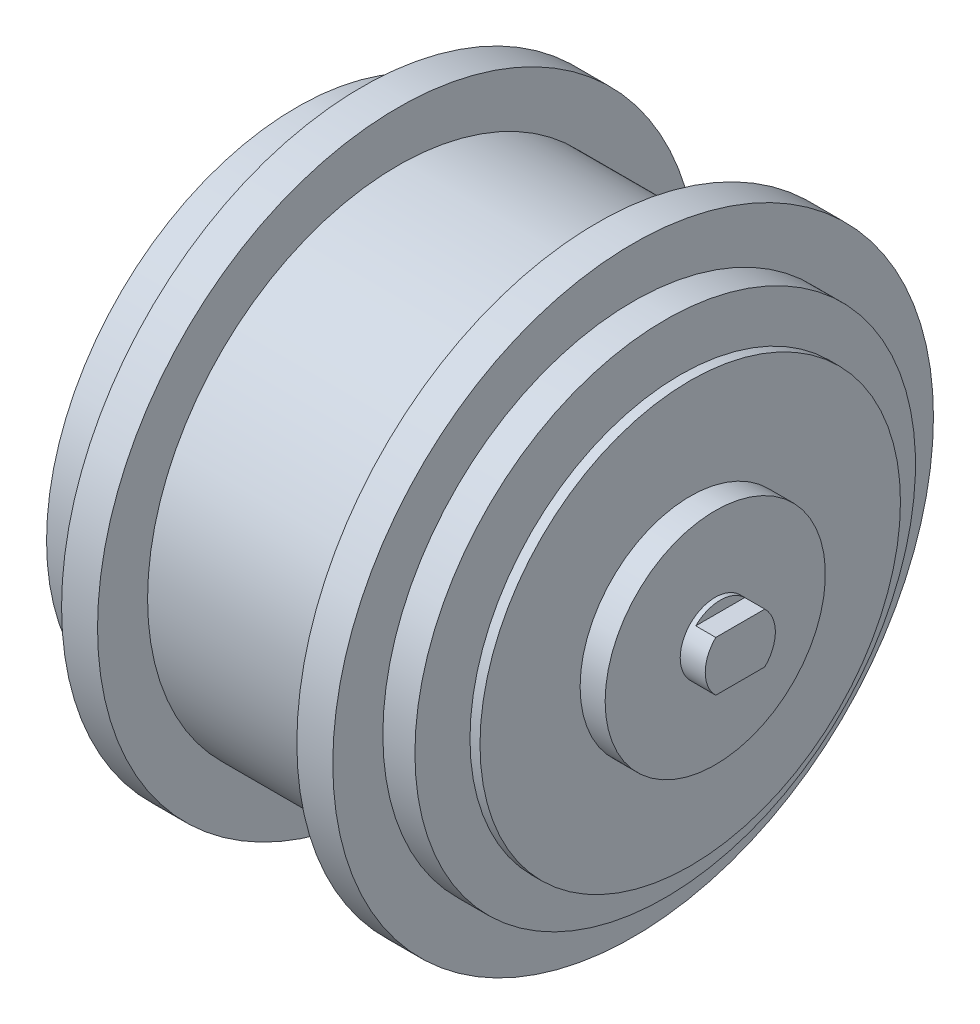
ISO-10303-21;
HEADER;
FILE_DESCRIPTION(('STEP AP214'),'2;1');
FILE_NAME('part.step','',(''),(''),'','','');
FILE_SCHEMA(('AUTOMOTIVE_DESIGN { 1 0 10303 214 1 1 1 1 }'));
ENDSEC;
DATA;
#1=APPLICATION_CONTEXT('core data for automotive mechanical design processes');
#2=APPLICATION_PROTOCOL_DEFINITION('international standard','automotive_design',2000,#1);
#3=PRODUCT_CONTEXT('',#1,'mechanical');
#4=PRODUCT('Part','Part','',(#3));
#5=PRODUCT_RELATED_PRODUCT_CATEGORY('part','',(#4));
#6=PRODUCT_DEFINITION_FORMATION('','',#4);
#7=PRODUCT_DEFINITION_CONTEXT('part definition',#1,'design');
#8=PRODUCT_DEFINITION('design','',#6,#7);
#9=PRODUCT_DEFINITION_SHAPE('','',#8);
#10=(LENGTH_UNIT() NAMED_UNIT(*) SI_UNIT(.MILLI.,.METRE.));
#11=(NAMED_UNIT(*) PLANE_ANGLE_UNIT() SI_UNIT($,.RADIAN.));
#12=(NAMED_UNIT(*) SI_UNIT($,.STERADIAN.) SOLID_ANGLE_UNIT());
#13=UNCERTAINTY_MEASURE_WITH_UNIT(LENGTH_MEASURE(1.E-05),#10,'distance_accuracy_value','');
#14=(GEOMETRIC_REPRESENTATION_CONTEXT(3) GLOBAL_UNCERTAINTY_ASSIGNED_CONTEXT((#13)) GLOBAL_UNIT_ASSIGNED_CONTEXT((#10,
#11,#12)) REPRESENTATION_CONTEXT('',''));
#15=CARTESIAN_POINT('',(0.,0.,0.));
#16=DIRECTION('',(0.,0.,1.));
#17=DIRECTION('',(1.,0.,0.));
#18=AXIS2_PLACEMENT_3D('',#15,#16,#17);
#19=CARTESIAN_POINT('',(0.,0.,0.));
#20=DIRECTION('',(-1.,0.,0.));
#21=DIRECTION('',(0.,0.,1.));
#22=AXIS2_PLACEMENT_3D('',#19,#20,#21);
#23=CYLINDRICAL_SURFACE('',#22,8.5);
#24=CARTESIAN_POINT('',(43.5,0.,0.));
#25=DIRECTION('',(-1.,0.,0.));
#26=DIRECTION('',(0.,0.,1.));
#27=AXIS2_PLACEMENT_3D('',#24,#25,#26);
#28=CIRCLE('',#27,8.5);
#29=CARTESIAN_POINT('',(43.5,0.,8.5));
#30=VERTEX_POINT('',#29);
#31=EDGE_CURVE('E11',#30,#30,#28,.T.);
#32=ORIENTED_EDGE('',*,*,#31,.T.);
#33=EDGE_LOOP('',(#32));
#34=FACE_BOUND('',#33,.T.);
#35=CARTESIAN_POINT('',(36.,0.,0.));
#36=DIRECTION('',(-1.,0.,0.));
#37=DIRECTION('',(0.,0.,1.));
#38=AXIS2_PLACEMENT_3D('',#35,#36,#37);
#39=CIRCLE('',#38,8.5);
#40=CARTESIAN_POINT('',(36.,0.,8.5));
#41=VERTEX_POINT('',#40);
#42=EDGE_CURVE('E299',#41,#41,#39,.T.);
#43=ORIENTED_EDGE('',*,*,#42,.F.);
#44=EDGE_LOOP('',(#43));
#45=FACE_BOUND('',#44,.T.);
#46=ADVANCED_FACE('F33',(#34,#45),#23,.T.);
#47=CARTESIAN_POINT('',(43.5,8.5,0.));
#48=DIRECTION('',(1.,0.,0.));
#49=DIRECTION('',(0.,0.,-1.));
#50=AXIS2_PLACEMENT_3D('',#47,#48,#49);
#51=PLANE('',#50);
#52=ORIENTED_EDGE('',*,*,#31,.F.);
#53=EDGE_LOOP('',(#52));
#54=FACE_BOUND('',#53,.T.);
#55=CARTESIAN_POINT('',(43.5,0.,0.));
#56=DIRECTION('',(-1.,0.,0.));
#57=DIRECTION('',(0.,0.,1.));
#58=AXIS2_PLACEMENT_3D('',#55,#56,#57);
#59=CIRCLE('',#58,17.);
#60=CARTESIAN_POINT('',(43.5,0.,17.));
#61=VERTEX_POINT('',#60);
#62=EDGE_CURVE('E40',#61,#61,#59,.T.);
#63=ORIENTED_EDGE('',*,*,#62,.T.);
#64=EDGE_LOOP('',(#63));
#65=FACE_BOUND('',#64,.T.);
#66=ADVANCED_FACE('F165',(#54,#65),#51,.F.);
#67=CARTESIAN_POINT('',(0.,0.,0.));
#68=DIRECTION('',(-1.,0.,0.));
#69=DIRECTION('',(0.,0.,1.));
#70=AXIS2_PLACEMENT_3D('',#67,#68,#69);
#71=CYLINDRICAL_SURFACE('',#70,17.);
#72=ORIENTED_EDGE('',*,*,#62,.F.);
#73=EDGE_LOOP('',(#72));
#74=FACE_BOUND('',#73,.T.);
#75=CARTESIAN_POINT('',(46.5,0.,0.));
#76=DIRECTION('',(-1.,0.,0.));
#77=DIRECTION('',(0.,0.,1.));
#78=AXIS2_PLACEMENT_3D('',#75,#76,#77);
#79=CIRCLE('',#78,17.);
#80=CARTESIAN_POINT('',(46.5,0.,17.));
#81=VERTEX_POINT('',#80);
#82=EDGE_CURVE('E160',#81,#81,#79,.T.);
#83=ORIENTED_EDGE('',*,*,#82,.T.);
#84=EDGE_LOOP('',(#83));
#85=FACE_BOUND('',#84,.T.);
#86=ADVANCED_FACE('F167',(#74,#85),#71,.T.);
#87=CARTESIAN_POINT('',(46.5,17.,0.));
#88=DIRECTION('',(1.,0.,0.));
#89=DIRECTION('',(0.,0.,-1.));
#90=AXIS2_PLACEMENT_3D('',#87,#88,#89);
#91=PLANE('',#90);
#92=ORIENTED_EDGE('',*,*,#82,.F.);
#93=EDGE_LOOP('',(#92));
#94=FACE_BOUND('',#93,.T.);
#95=CARTESIAN_POINT('',(46.5,0.,0.));
#96=DIRECTION('',(-1.,0.,0.));
#97=DIRECTION('',(0.,0.,1.));
#98=AXIS2_PLACEMENT_3D('',#95,#96,#97);
#99=CIRCLE('',#98,36.3185583303819);
#100=CARTESIAN_POINT('',(46.5,0.,36.3185583303819));
#101=VERTEX_POINT('',#100);
#102=EDGE_CURVE('E157',#101,#101,#99,.T.);
#103=ORIENTED_EDGE('',*,*,#102,.T.);
#104=EDGE_LOOP('',(#103));
#105=FACE_BOUND('',#104,.T.);
#106=ADVANCED_FACE('F170',(#94,#105),#91,.F.);
#107=CARTESIAN_POINT('',(53.5689655172414,0.,0.));
#108=DIRECTION('',(1.,0.,0.));
#109=DIRECTION('',(0.,0.,-1.));
#110=AXIS2_PLACEMENT_3D('',#107,#108,#109);
#111=CONICAL_SURFACE('',#110,50.,1.09389172935502);
#112=ORIENTED_EDGE('',*,*,#102,.F.);
#113=EDGE_LOOP('',(#112));
#114=FACE_BOUND('',#113,.T.);
#115=CARTESIAN_POINT('',(53.5689655172414,0.,0.));
#116=DIRECTION('',(-1.,0.,0.));
#117=DIRECTION('',(0.,0.,1.));
#118=AXIS2_PLACEMENT_3D('',#115,#116,#117);
#119=CIRCLE('',#118,50.);
#120=CARTESIAN_POINT('',(53.5689655172414,0.,50.));
#121=VERTEX_POINT('',#120);
#122=EDGE_CURVE('E154',#121,#121,#119,.T.);
#123=ORIENTED_EDGE('',*,*,#122,.T.);
#124=EDGE_LOOP('',(#123));
#125=FACE_BOUND('',#124,.T.);
#126=ADVANCED_FACE('F176',(#114,#125),#111,.T.);
#127=CARTESIAN_POINT('',(0.,0.,0.));
#128=DIRECTION('',(-1.,0.,0.));
#129=DIRECTION('',(0.,0.,1.));
#130=AXIS2_PLACEMENT_3D('',#127,#128,#129);
#131=CYLINDRICAL_SURFACE('',#130,50.);
#132=ORIENTED_EDGE('',*,*,#122,.F.);
#133=EDGE_LOOP('',(#132));
#134=FACE_BOUND('',#133,.T.);
#135=CARTESIAN_POINT('',(66.5689655172414,0.,0.));
#136=DIRECTION('',(-1.,0.,0.));
#137=DIRECTION('',(0.,0.,1.));
#138=AXIS2_PLACEMENT_3D('',#135,#136,#137);
#139=CIRCLE('',#138,50.);
#140=CARTESIAN_POINT('',(66.5689655172414,0.,50.));
#141=VERTEX_POINT('',#140);
#142=EDGE_CURVE('E151',#141,#141,#139,.T.);
#143=ORIENTED_EDGE('',*,*,#142,.T.);
#144=EDGE_LOOP('',(#143));
#145=FACE_BOUND('',#144,.T.);
#146=ADVANCED_FACE('F182',(#134,#145),#131,.T.);
#147=CARTESIAN_POINT('',(66.5689655172414,50.,0.));
#148=DIRECTION('',(1.,0.,0.));
#149=DIRECTION('',(0.,0.,-1.));
#150=AXIS2_PLACEMENT_3D('',#147,#148,#149);
#151=PLANE('',#150);
#152=ORIENTED_EDGE('',*,*,#142,.F.);
#153=EDGE_LOOP('',(#152));
#154=FACE_BOUND('',#153,.T.);
#155=CARTESIAN_POINT('',(66.5689655172414,0.,0.));
#156=DIRECTION('',(-1.,0.,0.));
#157=DIRECTION('',(0.,0.,1.));
#158=AXIS2_PLACEMENT_3D('',#155,#156,#157);
#159=CIRCLE('',#158,60.);
#160=CARTESIAN_POINT('',(66.5689655172414,0.,60.));
#161=VERTEX_POINT('',#160);
#162=EDGE_CURVE('E148',#161,#161,#159,.T.);
#163=ORIENTED_EDGE('',*,*,#162,.T.);
#164=EDGE_LOOP('',(#163));
#165=FACE_BOUND('',#164,.T.);
#166=ADVANCED_FACE('F188',(#154,#165),#151,.F.);
#167=CARTESIAN_POINT('',(0.,0.,0.));
#168=DIRECTION('',(-1.,0.,0.));
#169=DIRECTION('',(0.,0.,1.));
#170=AXIS2_PLACEMENT_3D('',#167,#168,#169);
#171=CYLINDRICAL_SURFACE('',#170,60.);
#172=ORIENTED_EDGE('',*,*,#162,.F.);
#173=EDGE_LOOP('',(#172));
#174=FACE_BOUND('',#173,.T.);
#175=CARTESIAN_POINT('',(73.7510344827586,0.,0.));
#176=DIRECTION('',(-1.,0.,0.));
#177=DIRECTION('',(0.,0.,1.));
#178=AXIS2_PLACEMENT_3D('',#175,#176,#177);
#179=CIRCLE('',#178,60.);
#180=CARTESIAN_POINT('',(73.7510344827586,0.,60.));
#181=VERTEX_POINT('',#180);
#182=EDGE_CURVE('E145',#181,#181,#179,.T.);
#183=ORIENTED_EDGE('',*,*,#182,.T.);
#184=EDGE_LOOP('',(#183));
#185=FACE_BOUND('',#184,.T.);
#186=ADVANCED_FACE('F194',(#174,#185),#171,.T.);
#187=CARTESIAN_POINT('',(73.7510344827586,60.,0.));
#188=DIRECTION('',(-1.,0.,0.));
#189=DIRECTION('',(0.,0.,1.));
#190=AXIS2_PLACEMENT_3D('',#187,#188,#189);
#191=PLANE('',#190);
#192=ORIENTED_EDGE('',*,*,#182,.F.);
#193=EDGE_LOOP('',(#192));
#194=FACE_BOUND('',#193,.T.);
#195=CARTESIAN_POINT('',(73.7510344827586,0.,0.));
#196=DIRECTION('',(-1.,0.,0.));
#197=DIRECTION('',(0.,0.,1.));
#198=AXIS2_PLACEMENT_3D('',#195,#196,#197);
#199=CIRCLE('',#198,50.);
#200=CARTESIAN_POINT('',(73.7510344827586,0.,50.));
#201=VERTEX_POINT('',#200);
#202=EDGE_CURVE('E142',#201,#201,#199,.T.);
#203=ORIENTED_EDGE('',*,*,#202,.T.);
#204=EDGE_LOOP('',(#203));
#205=FACE_BOUND('',#204,.T.);
#206=ADVANCED_FACE('F200',(#194,#205),#191,.F.);
#207=CARTESIAN_POINT('',(0.,0.,0.));
#208=DIRECTION('',(-1.,0.,0.));
#209=DIRECTION('',(0.,0.,1.));
#210=AXIS2_PLACEMENT_3D('',#207,#208,#209);
#211=CYLINDRICAL_SURFACE('',#210,50.);
#212=ORIENTED_EDGE('',*,*,#202,.F.);
#213=EDGE_LOOP('',(#212));
#214=FACE_BOUND('',#213,.T.);
#215=CARTESIAN_POINT('',(113.568965517241,0.,0.));
#216=DIRECTION('',(-1.,0.,0.));
#217=DIRECTION('',(0.,0.,1.));
#218=AXIS2_PLACEMENT_3D('',#215,#216,#217);
#219=CIRCLE('',#218,50.);
#220=CARTESIAN_POINT('',(113.568965517241,0.,50.));
#221=VERTEX_POINT('',#220);
#222=EDGE_CURVE('E139',#221,#221,#219,.T.);
#223=ORIENTED_EDGE('',*,*,#222,.T.);
#224=EDGE_LOOP('',(#223));
#225=FACE_BOUND('',#224,.T.);
#226=ADVANCED_FACE('F206',(#214,#225),#211,.T.);
#227=CARTESIAN_POINT('',(113.568965517241,50.,0.));
#228=DIRECTION('',(1.,0.,0.));
#229=DIRECTION('',(0.,0.,-1.));
#230=AXIS2_PLACEMENT_3D('',#227,#228,#229);
#231=PLANE('',#230);
#232=ORIENTED_EDGE('',*,*,#222,.F.);
#233=EDGE_LOOP('',(#232));
#234=FACE_BOUND('',#233,.T.);
#235=CARTESIAN_POINT('',(113.568965517241,0.,0.));
#236=DIRECTION('',(-1.,0.,0.));
#237=DIRECTION('',(0.,0.,1.));
#238=AXIS2_PLACEMENT_3D('',#235,#236,#237);
#239=CIRCLE('',#238,60.);
#240=CARTESIAN_POINT('',(113.568965517241,0.,60.));
#241=VERTEX_POINT('',#240);
#242=EDGE_CURVE('E136',#241,#241,#239,.T.);
#243=ORIENTED_EDGE('',*,*,#242,.T.);
#244=EDGE_LOOP('',(#243));
#245=FACE_BOUND('',#244,.T.);
#246=ADVANCED_FACE('F212',(#234,#245),#231,.F.);
#247=CARTESIAN_POINT('',(0.,0.,0.));
#248=DIRECTION('',(-1.,0.,0.));
#249=DIRECTION('',(0.,0.,1.));
#250=AXIS2_PLACEMENT_3D('',#247,#248,#249);
#251=CYLINDRICAL_SURFACE('',#250,60.);
#252=ORIENTED_EDGE('',*,*,#242,.F.);
#253=EDGE_LOOP('',(#252));
#254=FACE_BOUND('',#253,.T.);
#255=CARTESIAN_POINT('',(120.751034482759,0.,0.));
#256=DIRECTION('',(-1.,0.,0.));
#257=DIRECTION('',(0.,0.,1.));
#258=AXIS2_PLACEMENT_3D('',#255,#256,#257);
#259=CIRCLE('',#258,60.);
#260=CARTESIAN_POINT('',(120.751034482759,0.,60.));
#261=VERTEX_POINT('',#260);
#262=EDGE_CURVE('E133',#261,#261,#259,.T.);
#263=ORIENTED_EDGE('',*,*,#262,.T.);
#264=EDGE_LOOP('',(#263));
#265=FACE_BOUND('',#264,.T.);
#266=ADVANCED_FACE('F218',(#254,#265),#251,.T.);
#267=CARTESIAN_POINT('',(120.751034482759,60.,0.));
#268=DIRECTION('',(-1.,0.,0.));
#269=DIRECTION('',(0.,0.,1.));
#270=AXIS2_PLACEMENT_3D('',#267,#268,#269);
#271=PLANE('',#270);
#272=ORIENTED_EDGE('',*,*,#262,.F.);
#273=EDGE_LOOP('',(#272));
#274=FACE_BOUND('',#273,.T.);
#275=CARTESIAN_POINT('',(120.751034482759,0.,0.));
#276=DIRECTION('',(-1.,0.,0.));
#277=DIRECTION('',(0.,0.,1.));
#278=AXIS2_PLACEMENT_3D('',#275,#276,#277);
#279=CIRCLE('',#278,50.);
#280=CARTESIAN_POINT('',(120.751034482759,0.,50.));
#281=VERTEX_POINT('',#280);
#282=EDGE_CURVE('E130',#281,#281,#279,.T.);
#283=ORIENTED_EDGE('',*,*,#282,.T.);
#284=EDGE_LOOP('',(#283));
#285=FACE_BOUND('',#284,.T.);
#286=ADVANCED_FACE('F224',(#274,#285),#271,.F.);
#287=CARTESIAN_POINT('',(0.,0.,0.));
#288=DIRECTION('',(-1.,0.,0.));
#289=DIRECTION('',(0.,0.,1.));
#290=AXIS2_PLACEMENT_3D('',#287,#288,#289);
#291=CYLINDRICAL_SURFACE('',#290,50.);
#292=ORIENTED_EDGE('',*,*,#282,.F.);
#293=EDGE_LOOP('',(#292));
#294=FACE_BOUND('',#293,.T.);
#295=CARTESIAN_POINT('',(127.16,0.,0.));
#296=DIRECTION('',(-1.,0.,0.));
#297=DIRECTION('',(0.,0.,1.));
#298=AXIS2_PLACEMENT_3D('',#295,#296,#297);
#299=CIRCLE('',#298,50.);
#300=CARTESIAN_POINT('',(127.16,0.,50.));
#301=VERTEX_POINT('',#300);
#302=EDGE_CURVE('E127',#301,#301,#299,.T.);
#303=ORIENTED_EDGE('',*,*,#302,.T.);
#304=EDGE_LOOP('',(#303));
#305=FACE_BOUND('',#304,.T.);
#306=ADVANCED_FACE('F230',(#294,#305),#291,.T.);
#307=CARTESIAN_POINT('',(127.16,50.,0.));
#308=DIRECTION('',(-1.,0.,0.));
#309=DIRECTION('',(0.,0.,1.));
#310=AXIS2_PLACEMENT_3D('',#307,#308,#309);
#311=PLANE('',#310);
#312=ORIENTED_EDGE('',*,*,#302,.F.);
#313=EDGE_LOOP('',(#312));
#314=FACE_BOUND('',#313,.T.);
#315=CARTESIAN_POINT('',(127.16,0.,0.));
#316=DIRECTION('',(-1.,0.,0.));
#317=DIRECTION('',(0.,0.,1.));
#318=AXIS2_PLACEMENT_3D('',#315,#316,#317);
#319=CIRCLE('',#318,22.);
#320=CARTESIAN_POINT('',(127.16,0.,22.));
#321=VERTEX_POINT('',#320);
#322=EDGE_CURVE('E124',#321,#321,#319,.T.);
#323=ORIENTED_EDGE('',*,*,#322,.T.);
#324=EDGE_LOOP('',(#323));
#325=FACE_BOUND('',#324,.T.);
#326=ADVANCED_FACE('F236',(#314,#325),#311,.F.);
#327=CARTESIAN_POINT('',(0.,0.,0.));
#328=DIRECTION('',(-1.,0.,0.));
#329=DIRECTION('',(0.,0.,1.));
#330=AXIS2_PLACEMENT_3D('',#327,#328,#329);
#331=CYLINDRICAL_SURFACE('',#330,22.);
#332=ORIENTED_EDGE('',*,*,#322,.F.);
#333=EDGE_LOOP('',(#332));
#334=FACE_BOUND('',#333,.T.);
#335=CARTESIAN_POINT('',(130.16,0.,0.));
#336=DIRECTION('',(-1.,0.,0.));
#337=DIRECTION('',(0.,0.,1.));
#338=AXIS2_PLACEMENT_3D('',#335,#336,#337);
#339=CIRCLE('',#338,22.);
#340=CARTESIAN_POINT('',(130.16,0.,22.));
#341=VERTEX_POINT('',#340);
#342=EDGE_CURVE('E121',#341,#341,#339,.T.);
#343=ORIENTED_EDGE('',*,*,#342,.T.);
#344=EDGE_LOOP('',(#343));
#345=FACE_BOUND('',#344,.T.);
#346=ADVANCED_FACE('F242',(#334,#345),#331,.T.);
#347=CARTESIAN_POINT('',(130.16,22.,0.));
#348=DIRECTION('',(1.,0.,0.));
#349=DIRECTION('',(0.,0.,-1.));
#350=AXIS2_PLACEMENT_3D('',#347,#348,#349);
#351=PLANE('',#350);
#352=ORIENTED_EDGE('',*,*,#342,.F.);
#353=EDGE_LOOP('',(#352));
#354=FACE_BOUND('',#353,.T.);
#355=CARTESIAN_POINT('',(130.16,0.,0.));
#356=DIRECTION('',(-1.,0.,0.));
#357=DIRECTION('',(0.,0.,1.));
#358=AXIS2_PLACEMENT_3D('',#355,#356,#357);
#359=CIRCLE('',#358,42.);
#360=CARTESIAN_POINT('',(130.16,0.,42.));
#361=VERTEX_POINT('',#360);
#362=EDGE_CURVE('E118',#361,#361,#359,.T.);
#363=ORIENTED_EDGE('',*,*,#362,.T.);
#364=EDGE_LOOP('',(#363));
#365=FACE_BOUND('',#364,.T.);
#366=ADVANCED_FACE('F248',(#354,#365),#351,.F.);
#367=CARTESIAN_POINT('',(0.,0.,0.));
#368=DIRECTION('',(-1.,0.,0.));
#369=DIRECTION('',(0.,0.,1.));
#370=AXIS2_PLACEMENT_3D('',#367,#368,#369);
#371=CYLINDRICAL_SURFACE('',#370,42.);
#372=ORIENTED_EDGE('',*,*,#362,.F.);
#373=EDGE_LOOP('',(#372));
#374=FACE_BOUND('',#373,.T.);
#375=CARTESIAN_POINT('',(132.16,0.,0.));
#376=DIRECTION('',(-1.,0.,0.));
#377=DIRECTION('',(0.,0.,1.));
#378=AXIS2_PLACEMENT_3D('',#375,#376,#377);
#379=CIRCLE('',#378,42.);
#380=CARTESIAN_POINT('',(132.16,0.,42.));
#381=VERTEX_POINT('',#380);
#382=EDGE_CURVE('E115',#381,#381,#379,.T.);
#383=ORIENTED_EDGE('',*,*,#382,.T.);
#384=EDGE_LOOP('',(#383));
#385=FACE_BOUND('',#384,.T.);
#386=ADVANCED_FACE('F254',(#374,#385),#371,.T.);
#387=CARTESIAN_POINT('',(132.16,42.,0.));
#388=DIRECTION('',(-1.,0.,0.));
#389=DIRECTION('',(0.,0.,1.));
#390=AXIS2_PLACEMENT_3D('',#387,#388,#389);
#391=PLANE('',#390);
#392=ORIENTED_EDGE('',*,*,#382,.F.);
#393=EDGE_LOOP('',(#392));
#394=FACE_BOUND('',#393,.T.);
#395=CARTESIAN_POINT('',(132.16,0.,0.));
#396=DIRECTION('',(-1.,0.,0.));
#397=DIRECTION('',(0.,0.,1.));
#398=AXIS2_PLACEMENT_3D('',#395,#396,#397);
#399=CIRCLE('',#398,22.);
#400=CARTESIAN_POINT('',(132.16,0.,22.));
#401=VERTEX_POINT('',#400);
#402=EDGE_CURVE('E112',#401,#401,#399,.T.);
#403=ORIENTED_EDGE('',*,*,#402,.T.);
#404=EDGE_LOOP('',(#403));
#405=FACE_BOUND('',#404,.T.);
#406=ADVANCED_FACE('F260',(#394,#405),#391,.F.);
#407=CARTESIAN_POINT('',(0.,0.,0.));
#408=DIRECTION('',(-1.,0.,0.));
#409=DIRECTION('',(0.,0.,1.));
#410=AXIS2_PLACEMENT_3D('',#407,#408,#409);
#411=CYLINDRICAL_SURFACE('',#410,22.);
#412=ORIENTED_EDGE('',*,*,#402,.F.);
#413=EDGE_LOOP('',(#412));
#414=FACE_BOUND('',#413,.T.);
#415=CARTESIAN_POINT('',(137.16,0.,0.));
#416=DIRECTION('',(-1.,0.,0.));
#417=DIRECTION('',(0.,0.,1.));
#418=AXIS2_PLACEMENT_3D('',#415,#416,#417);
#419=CIRCLE('',#418,22.);
#420=CARTESIAN_POINT('',(137.16,0.,22.));
#421=VERTEX_POINT('',#420);
#422=EDGE_CURVE('E109',#421,#421,#419,.T.);
#423=ORIENTED_EDGE('',*,*,#422,.T.);
#424=EDGE_LOOP('',(#423));
#425=FACE_BOUND('',#424,.T.);
#426=ADVANCED_FACE('F266',(#414,#425),#411,.T.);
#427=CARTESIAN_POINT('',(137.16,22.,0.));
#428=DIRECTION('',(-1.,0.,0.));
#429=DIRECTION('',(0.,0.,1.));
#430=AXIS2_PLACEMENT_3D('',#427,#428,#429);
#431=PLANE('',#430);
#432=ORIENTED_EDGE('',*,*,#422,.F.);
#433=EDGE_LOOP('',(#432));
#434=FACE_BOUND('',#433,.T.);
#435=CARTESIAN_POINT('',(137.16,0.,0.));
#436=DIRECTION('',(-1.,0.,0.));
#437=DIRECTION('',(0.,0.,1.));
#438=AXIS2_PLACEMENT_3D('',#435,#436,#437);
#439=CIRCLE('',#438,6.99999999999999);
#440=CARTESIAN_POINT('',(137.16,0.,6.99999999999999));
#441=VERTEX_POINT('',#440);
#442=EDGE_CURVE('E106',#441,#441,#439,.T.);
#443=ORIENTED_EDGE('',*,*,#442,.T.);
#444=EDGE_LOOP('',(#443));
#445=FACE_BOUND('',#444,.T.);
#446=ADVANCED_FACE('F272',(#434,#445),#431,.F.);
#447=CARTESIAN_POINT('',(0.,0.,0.));
#448=DIRECTION('',(-1.,0.,0.));
#449=DIRECTION('',(0.,0.,1.));
#450=AXIS2_PLACEMENT_3D('',#447,#448,#449);
#451=CYLINDRICAL_SURFACE('',#450,7.);
#452=CARTESIAN_POINT('',(142.16,0.,0.));
#453=DIRECTION('',(-1.,0.,0.));
#454=DIRECTION('',(0.,0.,1.));
#455=AXIS2_PLACEMENT_3D('',#452,#453,#454);
#456=CIRCLE('',#455,7.);
#457=CARTESIAN_POINT('',(142.16,5.00000000000001,-4.89897948556635));
#458=VERTEX_POINT('',#457);
#459=CARTESIAN_POINT('',(142.16,-4.99999999999999,-4.89897948556636));
#460=VERTEX_POINT('',#459);
#461=EDGE_CURVE('E89',#458,#460,#456,.T.);
#462=ORIENTED_EDGE('',*,*,#461,.T.);
#463=DIRECTION('',(1.,0.,0.));
#464=VECTOR('',#463,1.);
#465=CARTESIAN_POINT('',(138.16,-4.99999999999999,-4.89897948556635));
#466=LINE('',#465,#464);
#467=CARTESIAN_POINT('',(138.16,-4.99999999999999,-4.89897948556635));
#468=VERTEX_POINT('',#467);
#469=EDGE_CURVE('E47',#468,#460,#466,.T.);
#470=ORIENTED_EDGE('',*,*,#469,.F.);
#471=CARTESIAN_POINT('',(138.16,0.,0.));
#472=DIRECTION('',(1.,0.,0.));
#473=DIRECTION('',(0.,0.,-1.));
#474=AXIS2_PLACEMENT_3D('',#471,#472,#473);
#475=CIRCLE('',#474,6.99999999999999);
#476=CARTESIAN_POINT('',(138.16,-4.99999999999999,4.89897948556635));
#477=VERTEX_POINT('',#476);
#478=EDGE_CURVE('E76',#477,#468,#475,.T.);
#479=ORIENTED_EDGE('',*,*,#478,.F.);
#480=DIRECTION('',(1.,0.,0.));
#481=VECTOR('',#480,1.);
#482=CARTESIAN_POINT('',(138.16,-4.99999999999999,4.89897948556635));
#483=LINE('',#482,#481);
#484=CARTESIAN_POINT('',(142.16,-4.99999999999999,4.89897948556635));
#485=VERTEX_POINT('',#484);
#486=EDGE_CURVE('E82',#477,#485,#483,.T.);
#487=ORIENTED_EDGE('',*,*,#486,.T.);
#488=CARTESIAN_POINT('',(142.16,5.00000000000001,4.89897948556635));
#489=VERTEX_POINT('',#488);
#490=EDGE_CURVE('E55',#485,#489,#456,.T.);
#491=ORIENTED_EDGE('',*,*,#490,.T.);
#492=DIRECTION('',(1.,0.,0.));
#493=VECTOR('',#492,1.);
#494=CARTESIAN_POINT('',(138.16,5.00000000000001,4.89897948556635));
#495=LINE('',#494,#493);
#496=CARTESIAN_POINT('',(138.16,5.00000000000001,4.89897948556635));
#497=VERTEX_POINT('',#496);
#498=EDGE_CURVE('E100',#497,#489,#495,.T.);
#499=ORIENTED_EDGE('',*,*,#498,.F.);
#500=CARTESIAN_POINT('',(138.16,0.,0.));
#501=DIRECTION('',(1.,0.,0.));
#502=DIRECTION('',(0.,0.,-1.));
#503=AXIS2_PLACEMENT_3D('',#500,#501,#502);
#504=CIRCLE('',#503,7.);
#505=CARTESIAN_POINT('',(138.16,5.00000000000001,-4.89897948556635));
#506=VERTEX_POINT('',#505);
#507=EDGE_CURVE('E95',#506,#497,#504,.T.);
#508=ORIENTED_EDGE('',*,*,#507,.F.);
#509=DIRECTION('',(1.,0.,0.));
#510=VECTOR('',#509,1.);
#511=CARTESIAN_POINT('',(138.16,5.00000000000001,-4.89897948556635));
#512=LINE('',#511,#510);
#513=EDGE_CURVE('E102',#506,#458,#512,.T.);
#514=ORIENTED_EDGE('',*,*,#513,.T.);
#515=EDGE_LOOP('',(#462,#470,#479,#487,#491,#499,#508,#514));
#516=FACE_BOUND('',#515,.T.);
#517=ORIENTED_EDGE('',*,*,#442,.F.);
#518=EDGE_LOOP('',(#517));
#519=FACE_BOUND('',#518,.T.);
#520=ADVANCED_FACE('F85',(#516,#519),#451,.T.);
#521=CARTESIAN_POINT('',(142.16,7.,0.));
#522=DIRECTION('',(-1.,0.,0.));
#523=DIRECTION('',(0.,0.,1.));
#524=AXIS2_PLACEMENT_3D('',#521,#522,#523);
#525=PLANE('',#524);
#526=ORIENTED_EDGE('',*,*,#490,.F.);
#527=DIRECTION('',(0.,0.,1.));
#528=VECTOR('',#527,1.);
#529=CARTESIAN_POINT('',(142.16,-4.99999999999999,4.89897948556635));
#530=LINE('',#529,#528);
#531=EDGE_CURVE('E79',#460,#485,#530,.T.);
#532=ORIENTED_EDGE('',*,*,#531,.F.);
#533=ORIENTED_EDGE('',*,*,#461,.F.);
#534=DIRECTION('',(0.,0.,-1.));
#535=VECTOR('',#534,1.);
#536=CARTESIAN_POINT('',(142.16,5.00000000000001,4.89897948556635));
#537=LINE('',#536,#535);
#538=EDGE_CURVE('E91',#489,#458,#537,.T.);
#539=ORIENTED_EDGE('',*,*,#538,.F.);
#540=EDGE_LOOP('',(#526,#532,#533,#539));
#541=FACE_BOUND('',#540,.T.);
#542=ADVANCED_FACE('F281',(#541),#525,.F.);
#543=CARTESIAN_POINT('',(138.16,5.00000000000001,4.89897948556635));
#544=DIRECTION('',(0.,-1.,0.));
#545=DIRECTION('',(0.,0.,-1.));
#546=AXIS2_PLACEMENT_3D('',#543,#544,#545);
#547=PLANE('',#546);
#548=ORIENTED_EDGE('',*,*,#538,.T.);
#549=ORIENTED_EDGE('',*,*,#513,.F.);
#550=DIRECTION('',(0.,0.,-1.));
#551=VECTOR('',#550,1.);
#552=CARTESIAN_POINT('',(138.16,5.00000000000001,4.89897948556635));
#553=LINE('',#552,#551);
#554=EDGE_CURVE('E97',#497,#506,#553,.T.);
#555=ORIENTED_EDGE('',*,*,#554,.F.);
#556=ORIENTED_EDGE('',*,*,#498,.T.);
#557=EDGE_LOOP('',(#548,#549,#555,#556));
#558=FACE_BOUND('',#557,.T.);
#559=ADVANCED_FACE('F286',(#558),#547,.F.);
#560=CARTESIAN_POINT('',(138.16,0.,0.));
#561=DIRECTION('',(1.,0.,0.));
#562=DIRECTION('',(0.,0.,-1.));
#563=AXIS2_PLACEMENT_3D('',#560,#561,#562);
#564=PLANE('',#563);
#565=ORIENTED_EDGE('',*,*,#507,.T.);
#566=ORIENTED_EDGE('',*,*,#554,.T.);
#567=EDGE_LOOP('',(#565,#566));
#568=FACE_BOUND('',#567,.T.);
#569=ADVANCED_FACE('F307',(#568),#564,.T.);
#570=CARTESIAN_POINT('',(138.16,-4.99999999999999,4.89897948556635));
#571=DIRECTION('',(0.,1.,0.));
#572=DIRECTION('',(0.,0.,1.));
#573=AXIS2_PLACEMENT_3D('',#570,#571,#572);
#574=PLANE('',#573);
#575=ORIENTED_EDGE('',*,*,#531,.T.);
#576=ORIENTED_EDGE('',*,*,#486,.F.);
#577=DIRECTION('',(0.,0.,1.));
#578=VECTOR('',#577,1.);
#579=CARTESIAN_POINT('',(138.16,-4.99999999999999,4.89897948556635));
#580=LINE('',#579,#578);
#581=EDGE_CURVE('E78',#468,#477,#580,.T.);
#582=ORIENTED_EDGE('',*,*,#581,.F.);
#583=ORIENTED_EDGE('',*,*,#469,.T.);
#584=EDGE_LOOP('',(#575,#576,#582,#583));
#585=FACE_BOUND('',#584,.T.);
#586=ADVANCED_FACE('F81',(#585),#574,.F.);
#587=CARTESIAN_POINT('',(138.16,0.,0.));
#588=DIRECTION('',(1.,0.,0.));
#589=DIRECTION('',(0.,0.,-1.));
#590=AXIS2_PLACEMENT_3D('',#587,#588,#589);
#591=PLANE('',#590);
#592=ORIENTED_EDGE('',*,*,#478,.T.);
#593=ORIENTED_EDGE('',*,*,#581,.T.);
#594=EDGE_LOOP('',(#592,#593));
#595=FACE_BOUND('',#594,.T.);
#596=ADVANCED_FACE('F77',(#595),#591,.T.);
#597=CARTESIAN_POINT('',(36.,0.,0.));
#598=DIRECTION('',(-1.,0.,0.));
#599=DIRECTION('',(0.,0.,1.));
#600=AXIS2_PLACEMENT_3D('',#597,#598,#599);
#601=PLANE('',#600);
#602=ORIENTED_EDGE('',*,*,#42,.T.);
#603=EDGE_LOOP('',(#602));
#604=FACE_BOUND('',#603,.T.);
#605=ADVANCED_FACE('F319',(#604),#601,.T.);
#606=CLOSED_SHELL('',(#46,#66,#86,#106,#126,#146,#166,#186,#206,#226,#246,#266,#286,#306,#326,
#346,#366,#386,#406,#426,#446,#520,#542,#559,#569,#586,#596,#605));
#607=MANIFOLD_SOLID_BREP('B2',#606);
#608=ADVANCED_BREP_SHAPE_REPRESENTATION('',(#18,#607),#14);
#609=SHAPE_DEFINITION_REPRESENTATION(#9,#608);
ENDSEC;
END-ISO-10303-21;
